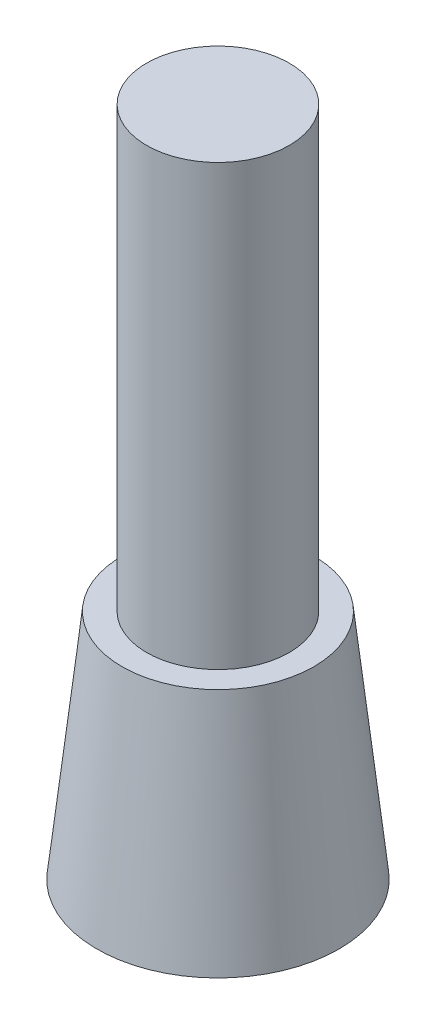
ISO-10303-21;
HEADER;
FILE_DESCRIPTION(('STEP AP214'),'2;1');
FILE_NAME('part.step','',(''),(''),'','','');
FILE_SCHEMA(('AUTOMOTIVE_DESIGN { 1 0 10303 214 1 1 1 1 }'));
ENDSEC;
DATA;
#1=APPLICATION_CONTEXT('core data for automotive mechanical design processes');
#2=APPLICATION_PROTOCOL_DEFINITION('international standard','automotive_design',2000,#1);
#3=PRODUCT_CONTEXT('',#1,'mechanical');
#4=PRODUCT('Part','Part','',(#3));
#5=PRODUCT_RELATED_PRODUCT_CATEGORY('part','',(#4));
#6=PRODUCT_DEFINITION_FORMATION('','',#4);
#7=PRODUCT_DEFINITION_CONTEXT('part definition',#1,'design');
#8=PRODUCT_DEFINITION('design','',#6,#7);
#9=PRODUCT_DEFINITION_SHAPE('','',#8);
#10=(LENGTH_UNIT() NAMED_UNIT(*) SI_UNIT(.MILLI.,.METRE.));
#11=(NAMED_UNIT(*) PLANE_ANGLE_UNIT() SI_UNIT($,.RADIAN.));
#12=(NAMED_UNIT(*) SI_UNIT($,.STERADIAN.) SOLID_ANGLE_UNIT());
#13=UNCERTAINTY_MEASURE_WITH_UNIT(LENGTH_MEASURE(1.E-05),#10,'distance_accuracy_value','');
#14=(GEOMETRIC_REPRESENTATION_CONTEXT(3) GLOBAL_UNCERTAINTY_ASSIGNED_CONTEXT((#13)) GLOBAL_UNIT_ASSIGNED_CONTEXT((#10,
#11,#12)) REPRESENTATION_CONTEXT('',''));
#15=CARTESIAN_POINT('',(0.,0.,0.));
#16=DIRECTION('',(0.,0.,1.));
#17=DIRECTION('',(1.,0.,0.));
#18=AXIS2_PLACEMENT_3D('',#15,#16,#17);
#19=CARTESIAN_POINT('',(2.4384,22.9362,0.));
#20=DIRECTION('',(0.,1.,0.));
#21=DIRECTION('',(-1.,0.,0.));
#22=AXIS2_PLACEMENT_3D('',#19,#20,#21);
#23=PLANE('',#22);
#24=CARTESIAN_POINT('',(0.,22.9362,0.));
#25=DIRECTION('',(0.,-1.,0.));
#26=DIRECTION('',(1.,0.,0.));
#27=AXIS2_PLACEMENT_3D('',#24,#25,#26);
#28=CIRCLE('',#27,2.4384);
#29=CARTESIAN_POINT('',(2.4384,22.9362,0.));
#30=VERTEX_POINT('',#29);
#31=EDGE_CURVE('E53',#30,#30,#28,.T.);
#32=ORIENTED_EDGE('',*,*,#31,.F.);
#33=EDGE_LOOP('',(#32));
#34=FACE_BOUND('',#33,.T.);
#35=ADVANCED_FACE('F31',(#34),#23,.T.);
#36=CARTESIAN_POINT('',(0.,6.35,0.));
#37=DIRECTION('',(0.,-1.,0.));
#38=DIRECTION('',(1.,0.,0.));
#39=AXIS2_PLACEMENT_3D('',#36,#37,#38);
#40=PLANE('',#39);
#41=CARTESIAN_POINT('',(0.,6.35,0.));
#42=DIRECTION('',(0.,-1.,0.));
#43=DIRECTION('',(1.,0.,0.));
#44=AXIS2_PLACEMENT_3D('',#41,#42,#43);
#45=CIRCLE('',#44,1.5);
#46=CARTESIAN_POINT('',(1.5,6.35,0.));
#47=VERTEX_POINT('',#46);
#48=EDGE_CURVE('E10',#47,#47,#45,.T.);
#49=ORIENTED_EDGE('',*,*,#48,.T.);
#50=EDGE_LOOP('',(#49));
#51=FACE_BOUND('',#50,.T.);
#52=ADVANCED_FACE('F61',(#51),#40,.T.);
#53=CARTESIAN_POINT('',(0.,0.,0.));
#54=DIRECTION('',(0.,-1.,0.));
#55=DIRECTION('',(1.,0.,0.));
#56=AXIS2_PLACEMENT_3D('',#53,#54,#55);
#57=CYLINDRICAL_SURFACE('',#56,1.5);
#58=CARTESIAN_POINT('',(0.,0.,0.));
#59=DIRECTION('',(0.,-1.,0.));
#60=DIRECTION('',(1.,0.,0.));
#61=AXIS2_PLACEMENT_3D('',#58,#59,#60);
#62=CIRCLE('',#61,1.5);
#63=CARTESIAN_POINT('',(1.5,0.,0.));
#64=VERTEX_POINT('',#63);
#65=EDGE_CURVE('E37',#64,#64,#62,.T.);
#66=ORIENTED_EDGE('',*,*,#65,.T.);
#67=EDGE_LOOP('',(#66));
#68=FACE_BOUND('',#67,.T.);
#69=ORIENTED_EDGE('',*,*,#48,.F.);
#70=EDGE_LOOP('',(#69));
#71=FACE_BOUND('',#70,.T.);
#72=ADVANCED_FACE('F65',(#68,#71),#57,.F.);
#73=CARTESIAN_POINT('',(1.5,0.,0.));
#74=DIRECTION('',(0.,-1.,0.));
#75=DIRECTION('',(1.,0.,0.));
#76=AXIS2_PLACEMENT_3D('',#73,#74,#75);
#77=PLANE('',#76);
#78=CARTESIAN_POINT('',(0.,0.,0.));
#79=DIRECTION('',(0.,-1.,0.));
#80=DIRECTION('',(1.,0.,0.));
#81=AXIS2_PLACEMENT_3D('',#78,#79,#80);
#82=CIRCLE('',#81,4.1402);
#83=CARTESIAN_POINT('',(4.1402,0.,0.));
#84=VERTEX_POINT('',#83);
#85=EDGE_CURVE('E41',#84,#84,#82,.T.);
#86=ORIENTED_EDGE('',*,*,#85,.T.);
#87=EDGE_LOOP('',(#86));
#88=FACE_BOUND('',#87,.T.);
#89=ORIENTED_EDGE('',*,*,#65,.F.);
#90=EDGE_LOOP('',(#89));
#91=FACE_BOUND('',#90,.T.);
#92=ADVANCED_FACE('F69',(#88,#91),#77,.T.);
#93=CARTESIAN_POINT('',(0.,0.,0.));
#94=DIRECTION('',(0.,-1.,0.));
#95=DIRECTION('',(1.,0.,0.));
#96=AXIS2_PLACEMENT_3D('',#93,#94,#95);
#97=CONICAL_SURFACE('',#96,4.1402,0.108546035007188);
#98=CARTESIAN_POINT('',(0.,7.9248,0.));
#99=DIRECTION('',(0.,-1.,0.));
#100=DIRECTION('',(1.,0.,0.));
#101=AXIS2_PLACEMENT_3D('',#98,#99,#100);
#102=CIRCLE('',#101,3.2766);
#103=CARTESIAN_POINT('',(3.2766,7.9248,0.));
#104=VERTEX_POINT('',#103);
#105=EDGE_CURVE('E45',#104,#104,#102,.T.);
#106=ORIENTED_EDGE('',*,*,#105,.T.);
#107=EDGE_LOOP('',(#106));
#108=FACE_BOUND('',#107,.T.);
#109=ORIENTED_EDGE('',*,*,#85,.F.);
#110=EDGE_LOOP('',(#109));
#111=FACE_BOUND('',#110,.T.);
#112=ADVANCED_FACE('F74',(#108,#111),#97,.T.);
#113=CARTESIAN_POINT('',(3.2766,7.9248,0.));
#114=DIRECTION('',(0.,1.,0.));
#115=DIRECTION('',(-1.,0.,0.));
#116=AXIS2_PLACEMENT_3D('',#113,#114,#115);
#117=PLANE('',#116);
#118=CARTESIAN_POINT('',(0.,7.9248,0.));
#119=DIRECTION('',(0.,-1.,0.));
#120=DIRECTION('',(1.,0.,0.));
#121=AXIS2_PLACEMENT_3D('',#118,#119,#120);
#122=CIRCLE('',#121,2.4384);
#123=CARTESIAN_POINT('',(2.4384,7.9248,0.));
#124=VERTEX_POINT('',#123);
#125=EDGE_CURVE('E50',#124,#124,#122,.T.);
#126=ORIENTED_EDGE('',*,*,#125,.T.);
#127=EDGE_LOOP('',(#126));
#128=FACE_BOUND('',#127,.T.);
#129=ORIENTED_EDGE('',*,*,#105,.F.);
#130=EDGE_LOOP('',(#129));
#131=FACE_BOUND('',#130,.T.);
#132=ADVANCED_FACE('F78',(#128,#131),#117,.T.);
#133=CARTESIAN_POINT('',(0.,0.,0.));
#134=DIRECTION('',(0.,-1.,0.));
#135=DIRECTION('',(1.,0.,0.));
#136=AXIS2_PLACEMENT_3D('',#133,#134,#135);
#137=CYLINDRICAL_SURFACE('',#136,2.4384);
#138=ORIENTED_EDGE('',*,*,#31,.T.);
#139=EDGE_LOOP('',(#138));
#140=FACE_BOUND('',#139,.T.);
#141=ORIENTED_EDGE('',*,*,#125,.F.);
#142=EDGE_LOOP('',(#141));
#143=FACE_BOUND('',#142,.T.);
#144=ADVANCED_FACE('F57',(#140,#143),#137,.T.);
#145=CLOSED_SHELL('',(#35,#52,#72,#92,#112,#132,#144));
#146=MANIFOLD_SOLID_BREP('B2',#145);
#147=ADVANCED_BREP_SHAPE_REPRESENTATION('',(#18,#146),#14);
#148=SHAPE_DEFINITION_REPRESENTATION(#9,#147);
ENDSEC;
END-ISO-10303-21;
